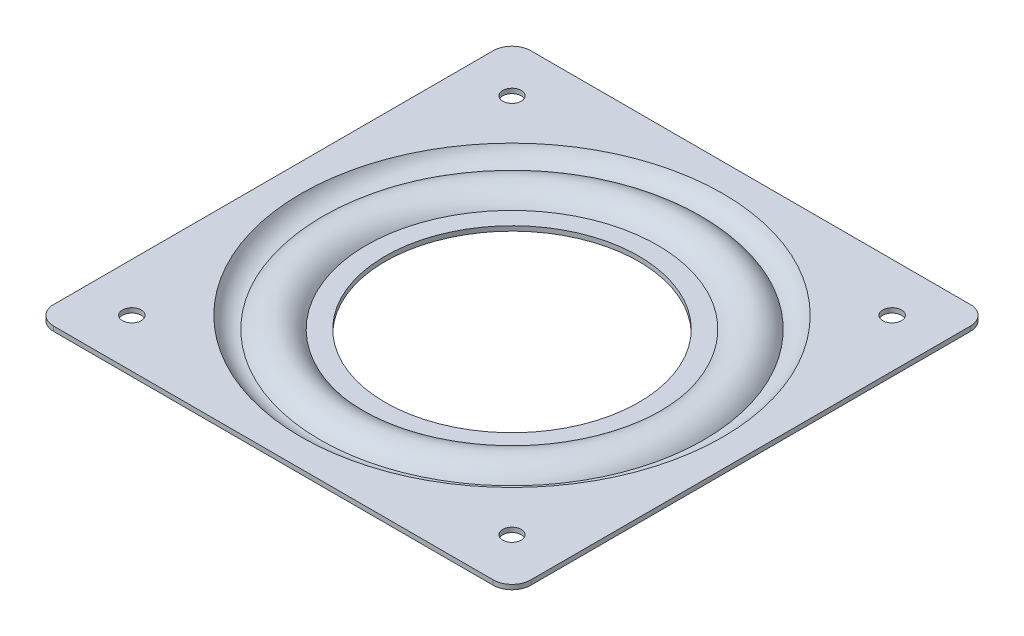
ISO-10303-21;
HEADER;
FILE_DESCRIPTION(('STEP AP214'),'2;1');
FILE_NAME('part.step','',(''),(''),'','','');
FILE_SCHEMA(('AUTOMOTIVE_DESIGN { 1 0 10303 214 1 1 1 1 }'));
ENDSEC;
DATA;
#1=APPLICATION_CONTEXT('core data for automotive mechanical design processes');
#2=APPLICATION_PROTOCOL_DEFINITION('international standard','automotive_design',2000,#1);
#3=PRODUCT_CONTEXT('',#1,'mechanical');
#4=PRODUCT('Part','Part','',(#3));
#5=PRODUCT_RELATED_PRODUCT_CATEGORY('part','',(#4));
#6=PRODUCT_DEFINITION_FORMATION('','',#4);
#7=PRODUCT_DEFINITION_CONTEXT('part definition',#1,'design');
#8=PRODUCT_DEFINITION('design','',#6,#7);
#9=PRODUCT_DEFINITION_SHAPE('','',#8);
#10=(LENGTH_UNIT() NAMED_UNIT(*) SI_UNIT(.MILLI.,.METRE.));
#11=(NAMED_UNIT(*) PLANE_ANGLE_UNIT() SI_UNIT($,.RADIAN.));
#12=(NAMED_UNIT(*) SI_UNIT($,.STERADIAN.) SOLID_ANGLE_UNIT());
#13=UNCERTAINTY_MEASURE_WITH_UNIT(LENGTH_MEASURE(1.E-05),#10,'distance_accuracy_value','');
#14=(GEOMETRIC_REPRESENTATION_CONTEXT(3) GLOBAL_UNCERTAINTY_ASSIGNED_CONTEXT((#13)) GLOBAL_UNIT_ASSIGNED_CONTEXT((#10,
#11,#12)) REPRESENTATION_CONTEXT('',''));
#15=CARTESIAN_POINT('',(0.,0.,0.));
#16=DIRECTION('',(0.,0.,1.));
#17=DIRECTION('',(1.,0.,0.));
#18=AXIS2_PLACEMENT_3D('',#15,#16,#17);
#19=CARTESIAN_POINT('',(0.,1.93021402871017,0.));
#20=DIRECTION('',(0.,1.,0.));
#21=DIRECTION('',(0.,0.,1.));
#22=AXIS2_PLACEMENT_3D('',#19,#20,#21);
#23=TOROIDAL_SURFACE('',#22,40.8455333460894,5.5);
#24=CARTESIAN_POINT('',(0.,-3.5402036630778,0.));
#25=DIRECTION('',(0.,1.,0.));
#26=DIRECTION('',(0.,0.,1.));
#27=AXIS2_PLACEMENT_3D('',#24,#25,#26);
#28=CIRCLE('',#27,40.2758577565007);
#29=CARTESIAN_POINT('',(0.,-3.5402036630778,40.2758577565007));
#30=VERTEX_POINT('',#29);
#31=EDGE_CURVE('E11',#30,#30,#28,.T.);
#32=ORIENTED_EDGE('',*,*,#31,.T.);
#33=EDGE_LOOP('',(#32));
#34=FACE_BOUND('',#33,.T.);
#35=CARTESIAN_POINT('',(0.,-1.,0.));
#36=DIRECTION('',(0.,1.,0.));
#37=DIRECTION('',(0.,0.,1.));
#38=AXIS2_PLACEMENT_3D('',#35,#36,#37);
#39=CIRCLE('',#38,45.4999770019897);
#40=CARTESIAN_POINT('',(0.,-1.,45.4999770019897));
#41=VERTEX_POINT('',#40);
#42=EDGE_CURVE('E46',#41,#41,#39,.F.);
#43=ORIENTED_EDGE('',*,*,#42,.T.);
#44=EDGE_LOOP('',(#43));
#45=FACE_BOUND('',#44,.T.);
#46=ADVANCED_FACE('F43',(#34,#45),#23,.T.);
#47=CARTESIAN_POINT('',(0.,-6.,0.));
#48=DIRECTION('',(0.,1.,0.));
#49=DIRECTION('',(0.,0.,1.));
#50=AXIS2_PLACEMENT_3D('',#47,#48,#49);
#51=TOROIDAL_SURFACE('',#50,35.9227666730447,5.);
#52=CARTESIAN_POINT('',(0.,-3.56978597128984,0.));
#53=DIRECTION('',(0.,1.,0.));
#54=DIRECTION('',(0.,0.,1.));
#55=AXIS2_PLACEMENT_3D('',#52,#53,#54);
#56=CIRCLE('',#55,31.5530916537029);
#57=CARTESIAN_POINT('',(0.,-3.56978597128984,31.5530916537029));
#58=VERTEX_POINT('',#57);
#59=EDGE_CURVE('E52',#58,#58,#56,.T.);
#60=ORIENTED_EDGE('',*,*,#59,.T.);
#61=EDGE_LOOP('',(#60));
#62=FACE_BOUND('',#61,.T.);
#63=ORIENTED_EDGE('',*,*,#31,.F.);
#64=EDGE_LOOP('',(#63));
#65=FACE_BOUND('',#64,.T.);
#66=ADVANCED_FACE('F204',(#62,#65),#51,.F.);
#67=CARTESIAN_POINT('',(0.,-3.56978597128984,0.));
#68=DIRECTION('',(0.,-1.,0.));
#69=DIRECTION('',(0.,0.,-1.));
#70=AXIS2_PLACEMENT_3D('',#67,#68,#69);
#71=PLANE('',#70);
#72=CARTESIAN_POINT('',(0.,-3.56978597128984,0.));
#73=DIRECTION('',(0.,1.,0.));
#74=DIRECTION('',(0.,0.,1.));
#75=AXIS2_PLACEMENT_3D('',#72,#73,#74);
#76=CIRCLE('',#75,27.);
#77=CARTESIAN_POINT('',(0.,-3.56978597128984,27.));
#78=VERTEX_POINT('',#77);
#79=EDGE_CURVE('E198',#78,#78,#76,.T.);
#80=ORIENTED_EDGE('',*,*,#79,.T.);
#81=EDGE_LOOP('',(#80));
#82=FACE_BOUND('',#81,.T.);
#83=ORIENTED_EDGE('',*,*,#59,.F.);
#84=EDGE_LOOP('',(#83));
#85=FACE_BOUND('',#84,.T.);
#86=ADVANCED_FACE('F207',(#82,#85),#71,.T.);
#87=CARTESIAN_POINT('',(0.,6.91716042477171,0.));
#88=DIRECTION('',(0.,1.,0.));
#89=DIRECTION('',(0.,0.,1.));
#90=AXIS2_PLACEMENT_3D('',#87,#88,#89);
#91=CYLINDRICAL_SURFACE('',#90,27.);
#92=ORIENTED_EDGE('',*,*,#79,.F.);
#93=EDGE_LOOP('',(#92));
#94=FACE_BOUND('',#93,.T.);
#95=CARTESIAN_POINT('',(0.,-2.56978597128984,0.));
#96=DIRECTION('',(0.,1.,0.));
#97=DIRECTION('',(0.,0.,1.));
#98=AXIS2_PLACEMENT_3D('',#95,#96,#97);
#99=CIRCLE('',#98,27.);
#100=CARTESIAN_POINT('',(0.,-2.56978597128984,27.));
#101=VERTEX_POINT('',#100);
#102=EDGE_CURVE('E195',#101,#101,#99,.T.);
#103=ORIENTED_EDGE('',*,*,#102,.T.);
#104=EDGE_LOOP('',(#103));
#105=FACE_BOUND('',#104,.T.);
#106=ADVANCED_FACE('F209',(#94,#105),#91,.F.);
#107=CARTESIAN_POINT('',(0.,-2.56978597128984,0.));
#108=DIRECTION('',(0.,-1.,0.));
#109=DIRECTION('',(0.,0.,-1.));
#110=AXIS2_PLACEMENT_3D('',#107,#108,#109);
#111=PLANE('',#110);
#112=ORIENTED_EDGE('',*,*,#102,.F.);
#113=EDGE_LOOP('',(#112));
#114=FACE_BOUND('',#113,.T.);
#115=CARTESIAN_POINT('',(0.,-2.56978597128984,0.));
#116=DIRECTION('',(0.,1.,0.));
#117=DIRECTION('',(0.,0.,1.));
#118=AXIS2_PLACEMENT_3D('',#115,#116,#117);
#119=CIRCLE('',#118,31.);
#120=CARTESIAN_POINT('',(0.,-2.56978597128984,31.));
#121=VERTEX_POINT('',#120);
#122=EDGE_CURVE('E192',#121,#121,#119,.T.);
#123=ORIENTED_EDGE('',*,*,#122,.T.);
#124=EDGE_LOOP('',(#123));
#125=FACE_BOUND('',#124,.T.);
#126=ADVANCED_FACE('F216',(#114,#125),#111,.F.);
#127=CARTESIAN_POINT('',(0.,-6.,0.));
#128=DIRECTION('',(0.,1.,0.));
#129=DIRECTION('',(0.,0.,1.));
#130=AXIS2_PLACEMENT_3D('',#127,#128,#129);
#131=TOROIDAL_SURFACE('',#130,35.9227666730447,6.);
#132=ORIENTED_EDGE('',*,*,#122,.F.);
#133=EDGE_LOOP('',(#132));
#134=FACE_BOUND('',#133,.T.);
#135=CARTESIAN_POINT('',(0.,-2.56978597128983,0.));
#136=DIRECTION('',(0.,1.,0.));
#137=DIRECTION('',(0.,0.,1.));
#138=AXIS2_PLACEMENT_3D('',#135,#136,#137);
#139=CIRCLE('',#138,40.8455333460895);
#140=CARTESIAN_POINT('',(0.,-2.56978597128983,40.8455333460895));
#141=VERTEX_POINT('',#140);
#142=EDGE_CURVE('E189',#141,#141,#139,.T.);
#143=ORIENTED_EDGE('',*,*,#142,.T.);
#144=EDGE_LOOP('',(#143));
#145=FACE_BOUND('',#144,.T.);
#146=ADVANCED_FACE('F311',(#134,#145),#131,.T.);
#147=CARTESIAN_POINT('',(0.,1.93021402871017,0.));
#148=DIRECTION('',(0.,1.,0.));
#149=DIRECTION('',(0.,0.,1.));
#150=AXIS2_PLACEMENT_3D('',#147,#148,#149);
#151=TOROIDAL_SURFACE('',#150,40.8455333460894,4.5);
#152=ORIENTED_EDGE('',*,*,#142,.F.);
#153=EDGE_LOOP('',(#152));
#154=FACE_BOUND('',#153,.T.);
#155=CARTESIAN_POINT('',(0.,0.,0.));
#156=DIRECTION('',(0.,1.,0.));
#157=DIRECTION('',(0.,0.,1.));
#158=AXIS2_PLACEMENT_3D('',#155,#156,#157);
#159=CIRCLE('',#158,44.9105393489596);
#160=CARTESIAN_POINT('',(0.,0.,44.9105393489596));
#161=VERTEX_POINT('',#160);
#162=EDGE_CURVE('E142',#161,#161,#159,.T.);
#163=ORIENTED_EDGE('',*,*,#162,.T.);
#164=EDGE_LOOP('',(#163));
#165=FACE_BOUND('',#164,.T.);
#166=ADVANCED_FACE('F279',(#154,#165),#151,.F.);
#167=CARTESIAN_POINT('',(-50.8,-1.,0.));
#168=DIRECTION('',(-1.,0.,0.));
#169=DIRECTION('',(0.,0.,1.));
#170=AXIS2_PLACEMENT_3D('',#167,#168,#169);
#171=PLANE('',#170);
#172=DIRECTION('',(0.,0.,1.));
#173=VECTOR('',#172,1.);
#174=CARTESIAN_POINT('',(-50.8,0.,0.));
#175=LINE('',#174,#173);
#176=CARTESIAN_POINT('',(-50.8,0.,-46.8000000000002));
#177=VERTEX_POINT('',#176);
#178=CARTESIAN_POINT('',(-50.8,0.,46.7999999999998));
#179=VERTEX_POINT('',#178);
#180=EDGE_CURVE('E157',#177,#179,#175,.T.);
#181=ORIENTED_EDGE('',*,*,#180,.F.);
#182=DIRECTION('',(0.,1.,0.));
#183=VECTOR('',#182,1.);
#184=CARTESIAN_POINT('',(-50.8,-1.,-46.8000000000002));
#185=LINE('',#184,#183);
#186=CARTESIAN_POINT('',(-50.8,-1.,-46.8000000000002));
#187=VERTEX_POINT('',#186);
#188=EDGE_CURVE('E60',#187,#177,#185,.T.);
#189=ORIENTED_EDGE('',*,*,#188,.F.);
#190=DIRECTION('',(0.,0.,1.));
#191=VECTOR('',#190,1.);
#192=CARTESIAN_POINT('',(-50.8,-1.,0.));
#193=LINE('',#192,#191);
#194=CARTESIAN_POINT('',(-50.8,-1.,46.7999999999998));
#195=VERTEX_POINT('',#194);
#196=EDGE_CURVE('E250',#187,#195,#193,.T.);
#197=ORIENTED_EDGE('',*,*,#196,.T.);
#198=DIRECTION('',(0.,1.,0.));
#199=VECTOR('',#198,1.);
#200=CARTESIAN_POINT('',(-50.8,-1.,46.7999999999998));
#201=LINE('',#200,#199);
#202=EDGE_CURVE('E101',#195,#179,#201,.T.);
#203=ORIENTED_EDGE('',*,*,#202,.T.);
#204=EDGE_LOOP('',(#181,#189,#197,#203));
#205=FACE_BOUND('',#204,.T.);
#206=ADVANCED_FACE('F270',(#205),#171,.T.);
#207=CARTESIAN_POINT('',(-46.8,-1.,-46.8000000000002));
#208=DIRECTION('',(0.,1.,0.));
#209=DIRECTION('',(0.,0.,1.));
#210=AXIS2_PLACEMENT_3D('',#207,#208,#209);
#211=CYLINDRICAL_SURFACE('',#210,4.00000000000001);
#212=CARTESIAN_POINT('',(-46.8,0.,-46.8000000000002));
#213=DIRECTION('',(0.,1.,0.));
#214=DIRECTION('',(0.,0.,1.));
#215=AXIS2_PLACEMENT_3D('',#212,#213,#214);
#216=CIRCLE('',#215,4.00000000000001);
#217=CARTESIAN_POINT('',(-46.8,0.,-50.8000000000002));
#218=VERTEX_POINT('',#217);
#219=EDGE_CURVE('E175',#218,#177,#216,.T.);
#220=ORIENTED_EDGE('',*,*,#219,.F.);
#221=DIRECTION('',(0.,1.,0.));
#222=VECTOR('',#221,1.);
#223=CARTESIAN_POINT('',(-46.8,-1.,-50.8000000000002));
#224=LINE('',#223,#222);
#225=CARTESIAN_POINT('',(-46.8,-1.,-50.8000000000002));
#226=VERTEX_POINT('',#225);
#227=EDGE_CURVE('E89',#226,#218,#224,.T.);
#228=ORIENTED_EDGE('',*,*,#227,.F.);
#229=CARTESIAN_POINT('',(-46.8,-1.,-46.8000000000002));
#230=DIRECTION('',(0.,1.,0.));
#231=DIRECTION('',(0.,0.,1.));
#232=AXIS2_PLACEMENT_3D('',#229,#230,#231);
#233=CIRCLE('',#232,4.00000000000001);
#234=EDGE_CURVE('E123',#226,#187,#233,.T.);
#235=ORIENTED_EDGE('',*,*,#234,.T.);
#236=ORIENTED_EDGE('',*,*,#188,.T.);
#237=EDGE_LOOP('',(#220,#228,#235,#236));
#238=FACE_BOUND('',#237,.T.);
#239=ADVANCED_FACE('F272',(#238),#211,.T.);
#240=CARTESIAN_POINT('',(0.,-1.,-50.8000000000002));
#241=DIRECTION('',(0.,0.,1.));
#242=DIRECTION('',(1.,0.,0.));
#243=AXIS2_PLACEMENT_3D('',#240,#241,#242);
#244=PLANE('',#243);
#245=DIRECTION('',(1.,0.,0.));
#246=VECTOR('',#245,1.);
#247=CARTESIAN_POINT('',(0.,0.,-50.8000000000002));
#248=LINE('',#247,#246);
#249=CARTESIAN_POINT('',(46.8,0.,-50.8000000000002));
#250=VERTEX_POINT('',#249);
#251=EDGE_CURVE('E127',#218,#250,#248,.T.);
#252=ORIENTED_EDGE('',*,*,#251,.T.);
#253=DIRECTION('',(0.,1.,0.));
#254=VECTOR('',#253,1.);
#255=CARTESIAN_POINT('',(46.8,-1.,-50.8000000000002));
#256=LINE('',#255,#254);
#257=CARTESIAN_POINT('',(46.8,-1.,-50.8000000000002));
#258=VERTEX_POINT('',#257);
#259=EDGE_CURVE('E125',#258,#250,#256,.T.);
#260=ORIENTED_EDGE('',*,*,#259,.F.);
#261=DIRECTION('',(1.,0.,0.));
#262=VECTOR('',#261,1.);
#263=CARTESIAN_POINT('',(0.,-1.,-50.8000000000002));
#264=LINE('',#263,#262);
#265=EDGE_CURVE('E118',#226,#258,#264,.T.);
#266=ORIENTED_EDGE('',*,*,#265,.F.);
#267=ORIENTED_EDGE('',*,*,#227,.T.);
#268=EDGE_LOOP('',(#252,#260,#266,#267));
#269=FACE_BOUND('',#268,.T.);
#270=ADVANCED_FACE('F126',(#269),#244,.F.);
#271=CARTESIAN_POINT('',(46.8,-1.,-46.8000000000002));
#272=DIRECTION('',(0.,1.,0.));
#273=DIRECTION('',(0.,0.,1.));
#274=AXIS2_PLACEMENT_3D('',#271,#272,#273);
#275=CYLINDRICAL_SURFACE('',#274,4.);
#276=CARTESIAN_POINT('',(46.8,0.,-46.8000000000002));
#277=DIRECTION('',(0.,1.,0.));
#278=DIRECTION('',(0.,0.,1.));
#279=AXIS2_PLACEMENT_3D('',#276,#277,#278);
#280=CIRCLE('',#279,4.);
#281=CARTESIAN_POINT('',(50.8,0.,-46.8000000000002));
#282=VERTEX_POINT('',#281);
#283=EDGE_CURVE('E172',#282,#250,#280,.T.);
#284=ORIENTED_EDGE('',*,*,#283,.F.);
#285=DIRECTION('',(0.,1.,0.));
#286=VECTOR('',#285,1.);
#287=CARTESIAN_POINT('',(50.8,-1.,-46.8000000000002));
#288=LINE('',#287,#286);
#289=CARTESIAN_POINT('',(50.8,-1.,-46.8000000000002));
#290=VERTEX_POINT('',#289);
#291=EDGE_CURVE('E131',#290,#282,#288,.T.);
#292=ORIENTED_EDGE('',*,*,#291,.F.);
#293=CARTESIAN_POINT('',(46.8,-1.,-46.8000000000002));
#294=DIRECTION('',(0.,1.,0.));
#295=DIRECTION('',(0.,0.,1.));
#296=AXIS2_PLACEMENT_3D('',#293,#294,#295);
#297=CIRCLE('',#296,4.);
#298=EDGE_CURVE('E122',#290,#258,#297,.T.);
#299=ORIENTED_EDGE('',*,*,#298,.T.);
#300=ORIENTED_EDGE('',*,*,#259,.T.);
#301=EDGE_LOOP('',(#284,#292,#299,#300));
#302=FACE_BOUND('',#301,.T.);
#303=ADVANCED_FACE('F133',(#302),#275,.T.);
#304=CARTESIAN_POINT('',(50.8,-1.,0.));
#305=DIRECTION('',(-1.,0.,0.));
#306=DIRECTION('',(0.,0.,1.));
#307=AXIS2_PLACEMENT_3D('',#304,#305,#306);
#308=PLANE('',#307);
#309=DIRECTION('',(0.,0.,1.));
#310=VECTOR('',#309,1.);
#311=CARTESIAN_POINT('',(50.8,0.,0.));
#312=LINE('',#311,#310);
#313=CARTESIAN_POINT('',(50.8,0.,46.7999999999998));
#314=VERTEX_POINT('',#313);
#315=EDGE_CURVE('E169',#282,#314,#312,.T.);
#316=ORIENTED_EDGE('',*,*,#315,.T.);
#317=DIRECTION('',(0.,1.,0.));
#318=VECTOR('',#317,1.);
#319=CARTESIAN_POINT('',(50.8,-1.,46.7999999999998));
#320=LINE('',#319,#318);
#321=CARTESIAN_POINT('',(50.8,-1.,46.7999999999998));
#322=VERTEX_POINT('',#321);
#323=EDGE_CURVE('E182',#322,#314,#320,.T.);
#324=ORIENTED_EDGE('',*,*,#323,.F.);
#325=DIRECTION('',(0.,0.,1.));
#326=VECTOR('',#325,1.);
#327=CARTESIAN_POINT('',(50.8,-1.,0.));
#328=LINE('',#327,#326);
#329=EDGE_CURVE('E135',#290,#322,#328,.T.);
#330=ORIENTED_EDGE('',*,*,#329,.F.);
#331=ORIENTED_EDGE('',*,*,#291,.T.);
#332=EDGE_LOOP('',(#316,#324,#330,#331));
#333=FACE_BOUND('',#332,.T.);
#334=ADVANCED_FACE('F285',(#333),#308,.F.);
#335=CARTESIAN_POINT('',(46.8,-1.,46.7999999999998));
#336=DIRECTION('',(0.,1.,0.));
#337=DIRECTION('',(0.,0.,1.));
#338=AXIS2_PLACEMENT_3D('',#335,#336,#337);
#339=CYLINDRICAL_SURFACE('',#338,4.00000000000001);
#340=CARTESIAN_POINT('',(46.8,0.,46.7999999999998));
#341=DIRECTION('',(0.,1.,0.));
#342=DIRECTION('',(0.,0.,1.));
#343=AXIS2_PLACEMENT_3D('',#340,#341,#342);
#344=CIRCLE('',#343,4.00000000000001);
#345=CARTESIAN_POINT('',(46.8,0.,50.7999999999998));
#346=VERTEX_POINT('',#345);
#347=EDGE_CURVE('E166',#346,#314,#344,.T.);
#348=ORIENTED_EDGE('',*,*,#347,.F.);
#349=DIRECTION('',(0.,1.,0.));
#350=VECTOR('',#349,1.);
#351=CARTESIAN_POINT('',(46.8,-1.,50.7999999999998));
#352=LINE('',#351,#350);
#353=CARTESIAN_POINT('',(46.8,-1.,50.7999999999998));
#354=VERTEX_POINT('',#353);
#355=EDGE_CURVE('E184',#354,#346,#352,.T.);
#356=ORIENTED_EDGE('',*,*,#355,.F.);
#357=CARTESIAN_POINT('',(46.8,-1.,46.7999999999998));
#358=DIRECTION('',(0.,1.,0.));
#359=DIRECTION('',(0.,0.,1.));
#360=AXIS2_PLACEMENT_3D('',#357,#358,#359);
#361=CIRCLE('',#360,4.00000000000001);
#362=EDGE_CURVE('E137',#354,#322,#361,.T.);
#363=ORIENTED_EDGE('',*,*,#362,.T.);
#364=ORIENTED_EDGE('',*,*,#323,.T.);
#365=EDGE_LOOP('',(#348,#356,#363,#364));
#366=FACE_BOUND('',#365,.T.);
#367=ADVANCED_FACE('F264',(#366),#339,.T.);
#368=CARTESIAN_POINT('',(0.,-1.,50.7999999999998));
#369=DIRECTION('',(0.,0.,1.));
#370=DIRECTION('',(1.,0.,0.));
#371=AXIS2_PLACEMENT_3D('',#368,#369,#370);
#372=PLANE('',#371);
#373=DIRECTION('',(1.,0.,0.));
#374=VECTOR('',#373,1.);
#375=CARTESIAN_POINT('',(0.,0.,50.7999999999998));
#376=LINE('',#375,#374);
#377=CARTESIAN_POINT('',(-46.8,0.,50.7999999999998));
#378=VERTEX_POINT('',#377);
#379=EDGE_CURVE('E163',#378,#346,#376,.T.);
#380=ORIENTED_EDGE('',*,*,#379,.F.);
#381=DIRECTION('',(0.,1.,0.));
#382=VECTOR('',#381,1.);
#383=CARTESIAN_POINT('',(-46.8,-1.,50.7999999999998));
#384=LINE('',#383,#382);
#385=CARTESIAN_POINT('',(-46.8,-1.,50.7999999999998));
#386=VERTEX_POINT('',#385);
#387=EDGE_CURVE('E186',#386,#378,#384,.T.);
#388=ORIENTED_EDGE('',*,*,#387,.F.);
#389=DIRECTION('',(1.,0.,0.));
#390=VECTOR('',#389,1.);
#391=CARTESIAN_POINT('',(0.,-1.,50.7999999999998));
#392=LINE('',#391,#390);
#393=EDGE_CURVE('E258',#386,#354,#392,.T.);
#394=ORIENTED_EDGE('',*,*,#393,.T.);
#395=ORIENTED_EDGE('',*,*,#355,.T.);
#396=EDGE_LOOP('',(#380,#388,#394,#395));
#397=FACE_BOUND('',#396,.T.);
#398=ADVANCED_FACE('F269',(#397),#372,.T.);
#399=CARTESIAN_POINT('',(-40.4800000000262,-1.,40.480000000026));
#400=DIRECTION('',(0.,1.,0.));
#401=DIRECTION('',(0.,0.,1.));
#402=AXIS2_PLACEMENT_3D('',#399,#400,#401);
#403=CYLINDRICAL_SURFACE('',#402,1.985);
#404=CARTESIAN_POINT('',(-40.4800000000262,-1.,40.480000000026));
#405=DIRECTION('',(0.,1.,0.));
#406=DIRECTION('',(0.,0.,1.));
#407=AXIS2_PLACEMENT_3D('',#404,#405,#406);
#408=CIRCLE('',#407,1.985);
#409=CARTESIAN_POINT('',(-40.4800000000262,-1.,42.465000000026));
#410=VERTEX_POINT('',#409);
#411=EDGE_CURVE('E248',#410,#410,#408,.T.);
#412=ORIENTED_EDGE('',*,*,#411,.F.);
#413=EDGE_LOOP('',(#412));
#414=FACE_BOUND('',#413,.T.);
#415=CARTESIAN_POINT('',(-40.4800000000262,0.,40.480000000026));
#416=DIRECTION('',(0.,1.,0.));
#417=DIRECTION('',(0.,0.,1.));
#418=AXIS2_PLACEMENT_3D('',#415,#416,#417);
#419=CIRCLE('',#418,1.985);
#420=CARTESIAN_POINT('',(-40.4800000000262,0.,42.465000000026));
#421=VERTEX_POINT('',#420);
#422=EDGE_CURVE('E154',#421,#421,#419,.T.);
#423=ORIENTED_EDGE('',*,*,#422,.T.);
#424=EDGE_LOOP('',(#423));
#425=FACE_BOUND('',#424,.T.);
#426=ADVANCED_FACE('F293',(#414,#425),#403,.F.);
#427=CARTESIAN_POINT('',(40.4800000000262,-1.,40.480000000026));
#428=DIRECTION('',(0.,1.,0.));
#429=DIRECTION('',(0.,0.,1.));
#430=AXIS2_PLACEMENT_3D('',#427,#428,#429);
#431=CYLINDRICAL_SURFACE('',#430,1.985);
#432=CARTESIAN_POINT('',(40.4800000000262,-1.,40.480000000026));
#433=DIRECTION('',(0.,1.,0.));
#434=DIRECTION('',(0.,0.,1.));
#435=AXIS2_PLACEMENT_3D('',#432,#433,#434);
#436=CIRCLE('',#435,1.985);
#437=CARTESIAN_POINT('',(40.4800000000262,-1.,42.465000000026));
#438=VERTEX_POINT('',#437);
#439=EDGE_CURVE('E245',#438,#438,#436,.T.);
#440=ORIENTED_EDGE('',*,*,#439,.F.);
#441=EDGE_LOOP('',(#440));
#442=FACE_BOUND('',#441,.T.);
#443=CARTESIAN_POINT('',(40.4800000000262,0.,40.480000000026));
#444=DIRECTION('',(0.,1.,0.));
#445=DIRECTION('',(0.,0.,1.));
#446=AXIS2_PLACEMENT_3D('',#443,#444,#445);
#447=CIRCLE('',#446,1.985);
#448=CARTESIAN_POINT('',(40.4800000000262,0.,42.465000000026));
#449=VERTEX_POINT('',#448);
#450=EDGE_CURVE('E151',#449,#449,#447,.T.);
#451=ORIENTED_EDGE('',*,*,#450,.T.);
#452=EDGE_LOOP('',(#451));
#453=FACE_BOUND('',#452,.T.);
#454=ADVANCED_FACE('F299',(#442,#453),#431,.F.);
#455=CARTESIAN_POINT('',(40.4800000000261,-1.,-40.4800000000263));
#456=DIRECTION('',(0.,1.,0.));
#457=DIRECTION('',(0.,0.,1.));
#458=AXIS2_PLACEMENT_3D('',#455,#456,#457);
#459=CYLINDRICAL_SURFACE('',#458,1.985);
#460=CARTESIAN_POINT('',(40.4800000000261,-1.,-40.4800000000263));
#461=DIRECTION('',(0.,1.,0.));
#462=DIRECTION('',(0.,0.,1.));
#463=AXIS2_PLACEMENT_3D('',#460,#461,#462);
#464=CIRCLE('',#463,1.985);
#465=CARTESIAN_POINT('',(40.4800000000261,-1.,-38.4950000000263));
#466=VERTEX_POINT('',#465);
#467=EDGE_CURVE('E241',#466,#466,#464,.T.);
#468=ORIENTED_EDGE('',*,*,#467,.F.);
#469=EDGE_LOOP('',(#468));
#470=FACE_BOUND('',#469,.T.);
#471=CARTESIAN_POINT('',(40.4800000000261,0.,-40.4800000000263));
#472=DIRECTION('',(0.,1.,0.));
#473=DIRECTION('',(0.,0.,1.));
#474=AXIS2_PLACEMENT_3D('',#471,#472,#473);
#475=CIRCLE('',#474,1.985);
#476=CARTESIAN_POINT('',(40.4800000000261,0.,-38.4950000000263));
#477=VERTEX_POINT('',#476);
#478=EDGE_CURVE('E148',#477,#477,#475,.T.);
#479=ORIENTED_EDGE('',*,*,#478,.T.);
#480=EDGE_LOOP('',(#479));
#481=FACE_BOUND('',#480,.T.);
#482=ADVANCED_FACE('F302',(#470,#481),#459,.F.);
#483=CARTESIAN_POINT('',(-40.4800000000262,-1.,-40.4800000000263));
#484=DIRECTION('',(0.,1.,0.));
#485=DIRECTION('',(0.,0.,1.));
#486=AXIS2_PLACEMENT_3D('',#483,#484,#485);
#487=CYLINDRICAL_SURFACE('',#486,1.985);
#488=CARTESIAN_POINT('',(-40.4800000000262,-1.,-40.4800000000263));
#489=DIRECTION('',(0.,1.,0.));
#490=DIRECTION('',(0.,0.,1.));
#491=AXIS2_PLACEMENT_3D('',#488,#489,#490);
#492=CIRCLE('',#491,1.985);
#493=CARTESIAN_POINT('',(-40.4800000000262,-1.,-38.4950000000263));
#494=VERTEX_POINT('',#493);
#495=EDGE_CURVE('E178',#494,#494,#492,.T.);
#496=ORIENTED_EDGE('',*,*,#495,.F.);
#497=EDGE_LOOP('',(#496));
#498=FACE_BOUND('',#497,.T.);
#499=CARTESIAN_POINT('',(-40.4800000000262,0.,-40.4800000000263));
#500=DIRECTION('',(0.,1.,0.));
#501=DIRECTION('',(0.,0.,1.));
#502=AXIS2_PLACEMENT_3D('',#499,#500,#501);
#503=CIRCLE('',#502,1.985);
#504=CARTESIAN_POINT('',(-40.4800000000262,0.,-38.4950000000263));
#505=VERTEX_POINT('',#504);
#506=EDGE_CURVE('E145',#505,#505,#503,.T.);
#507=ORIENTED_EDGE('',*,*,#506,.T.);
#508=EDGE_LOOP('',(#507));
#509=FACE_BOUND('',#508,.T.);
#510=ADVANCED_FACE('F295',(#498,#509),#487,.F.);
#511=CARTESIAN_POINT('',(-46.8,-1.,46.7999999999998));
#512=DIRECTION('',(0.,1.,0.));
#513=DIRECTION('',(0.,0.,1.));
#514=AXIS2_PLACEMENT_3D('',#511,#512,#513);
#515=CYLINDRICAL_SURFACE('',#514,4.);
#516=CARTESIAN_POINT('',(-46.8,0.,46.7999999999998));
#517=DIRECTION('',(0.,1.,0.));
#518=DIRECTION('',(0.,0.,1.));
#519=AXIS2_PLACEMENT_3D('',#516,#517,#518);
#520=CIRCLE('',#519,4.);
#521=EDGE_CURVE('E160',#179,#378,#520,.T.);
#522=ORIENTED_EDGE('',*,*,#521,.F.);
#523=ORIENTED_EDGE('',*,*,#202,.F.);
#524=CARTESIAN_POINT('',(-46.8,-1.,46.7999999999998));
#525=DIRECTION('',(0.,1.,0.));
#526=DIRECTION('',(0.,0.,1.));
#527=AXIS2_PLACEMENT_3D('',#524,#525,#526);
#528=CIRCLE('',#527,4.);
#529=EDGE_CURVE('E252',#195,#386,#528,.T.);
#530=ORIENTED_EDGE('',*,*,#529,.T.);
#531=ORIENTED_EDGE('',*,*,#387,.T.);
#532=EDGE_LOOP('',(#522,#523,#530,#531));
#533=FACE_BOUND('',#532,.T.);
#534=ADVANCED_FACE('F233',(#533),#515,.T.);
#535=CARTESIAN_POINT('',(0.,-1.,0.));
#536=DIRECTION('',(0.,1.,0.));
#537=DIRECTION('',(0.,0.,1.));
#538=AXIS2_PLACEMENT_3D('',#535,#536,#537);
#539=PLANE('',#538);
#540=ORIENTED_EDGE('',*,*,#42,.F.);
#541=EDGE_LOOP('',(#540));
#542=FACE_BOUND('',#541,.T.);
#543=ORIENTED_EDGE('',*,*,#495,.T.);
#544=EDGE_LOOP('',(#543));
#545=FACE_BOUND('',#544,.T.);
#546=ORIENTED_EDGE('',*,*,#467,.T.);
#547=EDGE_LOOP('',(#546));
#548=FACE_BOUND('',#547,.T.);
#549=ORIENTED_EDGE('',*,*,#439,.T.);
#550=EDGE_LOOP('',(#549));
#551=FACE_BOUND('',#550,.T.);
#552=ORIENTED_EDGE('',*,*,#411,.T.);
#553=EDGE_LOOP('',(#552));
#554=FACE_BOUND('',#553,.T.);
#555=ORIENTED_EDGE('',*,*,#196,.F.);
#556=ORIENTED_EDGE('',*,*,#234,.F.);
#557=ORIENTED_EDGE('',*,*,#265,.T.);
#558=ORIENTED_EDGE('',*,*,#298,.F.);
#559=ORIENTED_EDGE('',*,*,#329,.T.);
#560=ORIENTED_EDGE('',*,*,#362,.F.);
#561=ORIENTED_EDGE('',*,*,#393,.F.);
#562=ORIENTED_EDGE('',*,*,#529,.F.);
#563=EDGE_LOOP('',(#555,#556,#557,#558,#559,#560,#561,#562));
#564=FACE_BOUND('',#563,.T.);
#565=ADVANCED_FACE('F120',(#542,#545,#548,#551,#554,#564),#539,.F.);
#566=CARTESIAN_POINT('',(0.,0.,0.));
#567=DIRECTION('',(0.,1.,0.));
#568=DIRECTION('',(0.,0.,1.));
#569=AXIS2_PLACEMENT_3D('',#566,#567,#568);
#570=PLANE('',#569);
#571=ORIENTED_EDGE('',*,*,#162,.F.);
#572=EDGE_LOOP('',(#571));
#573=FACE_BOUND('',#572,.T.);
#574=ORIENTED_EDGE('',*,*,#506,.F.);
#575=EDGE_LOOP('',(#574));
#576=FACE_BOUND('',#575,.T.);
#577=ORIENTED_EDGE('',*,*,#478,.F.);
#578=EDGE_LOOP('',(#577));
#579=FACE_BOUND('',#578,.T.);
#580=ORIENTED_EDGE('',*,*,#450,.F.);
#581=EDGE_LOOP('',(#580));
#582=FACE_BOUND('',#581,.T.);
#583=ORIENTED_EDGE('',*,*,#422,.F.);
#584=EDGE_LOOP('',(#583));
#585=FACE_BOUND('',#584,.T.);
#586=ORIENTED_EDGE('',*,*,#180,.T.);
#587=ORIENTED_EDGE('',*,*,#521,.T.);
#588=ORIENTED_EDGE('',*,*,#379,.T.);
#589=ORIENTED_EDGE('',*,*,#347,.T.);
#590=ORIENTED_EDGE('',*,*,#315,.F.);
#591=ORIENTED_EDGE('',*,*,#283,.T.);
#592=ORIENTED_EDGE('',*,*,#251,.F.);
#593=ORIENTED_EDGE('',*,*,#219,.T.);
#594=EDGE_LOOP('',(#586,#587,#588,#589,#590,#591,#592,#593));
#595=FACE_BOUND('',#594,.T.);
#596=ADVANCED_FACE('F232',(#573,#576,#579,#582,#585,#595),#570,.T.);
#597=CLOSED_SHELL('',(#46,#66,#86,#106,#126,#146,#166,#206,#239,#270,#303,#334,#367,#398,#426,
#454,#482,#510,#534,#565,#596));
#598=MANIFOLD_SOLID_BREP('B2',#597);
#599=ADVANCED_BREP_SHAPE_REPRESENTATION('',(#18,#598),#14);
#600=SHAPE_DEFINITION_REPRESENTATION(#9,#599);
ENDSEC;
END-ISO-10303-21;
